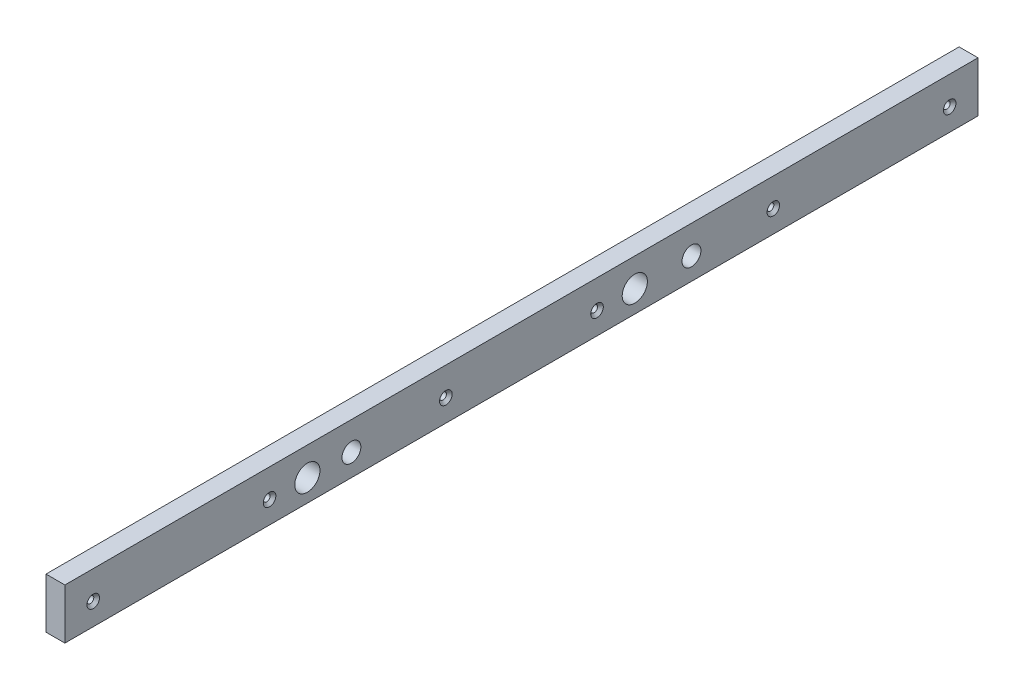
ISO-10303-21;
HEADER;
FILE_DESCRIPTION(('STEP AP214'),'2;1');
FILE_NAME('part.step','',(''),(''),'','','');
FILE_SCHEMA(('AUTOMOTIVE_DESIGN { 1 0 10303 214 1 1 1 1 }'));
ENDSEC;
DATA;
#1=APPLICATION_CONTEXT('core data for automotive mechanical design processes');
#2=APPLICATION_PROTOCOL_DEFINITION('international standard','automotive_design',2000,#1);
#3=PRODUCT_CONTEXT('',#1,'mechanical');
#4=PRODUCT('Part','Part','',(#3));
#5=PRODUCT_RELATED_PRODUCT_CATEGORY('part','',(#4));
#6=PRODUCT_DEFINITION_FORMATION('','',#4);
#7=PRODUCT_DEFINITION_CONTEXT('part definition',#1,'design');
#8=PRODUCT_DEFINITION('design','',#6,#7);
#9=PRODUCT_DEFINITION_SHAPE('','',#8);
#10=(LENGTH_UNIT() NAMED_UNIT(*) SI_UNIT(.MILLI.,.METRE.));
#11=(NAMED_UNIT(*) PLANE_ANGLE_UNIT() SI_UNIT($,.RADIAN.));
#12=(NAMED_UNIT(*) SI_UNIT($,.STERADIAN.) SOLID_ANGLE_UNIT());
#13=UNCERTAINTY_MEASURE_WITH_UNIT(LENGTH_MEASURE(1.E-05),#10,'distance_accuracy_value','');
#14=(GEOMETRIC_REPRESENTATION_CONTEXT(3) GLOBAL_UNCERTAINTY_ASSIGNED_CONTEXT((#13)) GLOBAL_UNIT_ASSIGNED_CONTEXT((#10,
#11,#12)) REPRESENTATION_CONTEXT('',''));
#15=CARTESIAN_POINT('',(0.,0.,0.));
#16=DIRECTION('',(0.,0.,1.));
#17=DIRECTION('',(1.,0.,0.));
#18=AXIS2_PLACEMENT_3D('',#15,#16,#17);
#19=CARTESIAN_POINT('',(4.7625,12.7,230.1875));
#20=DIRECTION('',(-1.,0.,0.));
#21=DIRECTION('',(0.,-1.,0.));
#22=AXIS2_PLACEMENT_3D('',#19,#20,#21);
#23=PLANE('',#22);
#24=CARTESIAN_POINT('',(4.7625,-1.5875,-38.1));
#25=DIRECTION('',(1.,0.,0.));
#26=DIRECTION('',(0.,0.,-1.));
#27=AXIS2_PLACEMENT_3D('',#24,#25,#26);
#28=CIRCLE('',#27,3.175);
#29=CARTESIAN_POINT('',(4.7625,-1.5875,-41.275));
#30=VERTEX_POINT('',#29);
#31=EDGE_CURVE('E522',#30,#30,#28,.T.);
#32=ORIENTED_EDGE('',*,*,#31,.F.);
#33=EDGE_LOOP('',(#32));
#34=FACE_BOUND('',#33,.T.);
#35=CARTESIAN_POINT('',(4.7625,-1.5875,215.9));
#36=DIRECTION('',(1.,0.,0.));
#37=DIRECTION('',(0.,0.,-1.));
#38=AXIS2_PLACEMENT_3D('',#35,#36,#37);
#39=CIRCLE('',#38,3.175);
#40=CARTESIAN_POINT('',(4.7625,-1.5875,212.725));
#41=VERTEX_POINT('',#40);
#42=EDGE_CURVE('E507',#41,#41,#39,.T.);
#43=ORIENTED_EDGE('',*,*,#42,.F.);
#44=EDGE_LOOP('',(#43));
#45=FACE_BOUND('',#44,.T.);
#46=CARTESIAN_POINT('',(4.7625,-1.5875,-127.));
#47=DIRECTION('',(1.,0.,0.));
#48=DIRECTION('',(0.,0.,-1.));
#49=AXIS2_PLACEMENT_3D('',#46,#47,#48);
#50=CIRCLE('',#49,3.175);
#51=CARTESIAN_POINT('',(4.7625,-1.5875,-130.175));
#52=VERTEX_POINT('',#51);
#53=EDGE_CURVE('E156',#52,#52,#50,.T.);
#54=ORIENTED_EDGE('',*,*,#53,.F.);
#55=EDGE_LOOP('',(#54));
#56=FACE_BOUND('',#55,.T.);
#57=CARTESIAN_POINT('',(4.7625,-1.5875,85.725));
#58=DIRECTION('',(-1.,0.,0.));
#59=DIRECTION('',(0.,0.,1.));
#60=AXIS2_PLACEMENT_3D('',#57,#58,#59);
#61=CIRCLE('',#60,4.7625);
#62=CARTESIAN_POINT('',(4.7625,-1.5875,90.4875));
#63=VERTEX_POINT('',#62);
#64=EDGE_CURVE('E170',#63,#63,#61,.T.);
#65=ORIENTED_EDGE('',*,*,#64,.T.);
#66=EDGE_LOOP('',(#65));
#67=FACE_BOUND('',#66,.T.);
#68=CARTESIAN_POINT('',(4.7625,-1.5875,-85.725));
#69=DIRECTION('',(-1.,0.,0.));
#70=DIRECTION('',(0.,0.,1.));
#71=AXIS2_PLACEMENT_3D('',#68,#69,#70);
#72=CIRCLE('',#71,4.7625);
#73=CARTESIAN_POINT('',(4.7625,-1.5875,-80.9625));
#74=VERTEX_POINT('',#73);
#75=EDGE_CURVE('E181',#74,#74,#72,.T.);
#76=ORIENTED_EDGE('',*,*,#75,.T.);
#77=EDGE_LOOP('',(#76));
#78=FACE_BOUND('',#77,.T.);
#79=CARTESIAN_POINT('',(4.7625,-1.5875,-57.15));
#80=DIRECTION('',(1.,0.,0.));
#81=DIRECTION('',(0.,1.,0.));
#82=AXIS2_PLACEMENT_3D('',#79,#80,#81);
#83=CIRCLE('',#82,6.35000000000003);
#84=CARTESIAN_POINT('',(4.7625,4.76250000000003,-57.15));
#85=VERTEX_POINT('',#84);
#86=EDGE_CURVE('E183',#85,#85,#83,.T.);
#87=ORIENTED_EDGE('',*,*,#86,.F.);
#88=EDGE_LOOP('',(#87));
#89=FACE_BOUND('',#88,.T.);
#90=CARTESIAN_POINT('',(4.7625,-1.5875,107.95));
#91=DIRECTION('',(1.,0.,0.));
#92=DIRECTION('',(0.,1.,0.));
#93=AXIS2_PLACEMENT_3D('',#90,#91,#92);
#94=CIRCLE('',#93,6.35);
#95=CARTESIAN_POINT('',(4.7625,4.7625,107.95));
#96=VERTEX_POINT('',#95);
#97=EDGE_CURVE('E124',#96,#96,#94,.T.);
#98=ORIENTED_EDGE('',*,*,#97,.F.);
#99=EDGE_LOOP('',(#98));
#100=FACE_BOUND('',#99,.T.);
#101=DIRECTION('',(0.,1.,0.));
#102=VECTOR('',#101,1.);
#103=CARTESIAN_POINT('',(4.7625,12.7,-230.1875));
#104=LINE('',#103,#102);
#105=CARTESIAN_POINT('',(4.7625,-12.7,-230.1875));
#106=VERTEX_POINT('',#105);
#107=CARTESIAN_POINT('',(4.7625,12.7,-230.1875));
#108=VERTEX_POINT('',#107);
#109=EDGE_CURVE('E73',#106,#108,#104,.T.);
#110=ORIENTED_EDGE('',*,*,#109,.T.);
#111=DIRECTION('',(0.,0.,-1.));
#112=VECTOR('',#111,1.);
#113=CARTESIAN_POINT('',(4.7625,12.7,230.1875));
#114=LINE('',#113,#112);
#115=CARTESIAN_POINT('',(4.7625,12.7,230.1875));
#116=VERTEX_POINT('',#115);
#117=EDGE_CURVE('E100',#116,#108,#114,.T.);
#118=ORIENTED_EDGE('',*,*,#117,.F.);
#119=DIRECTION('',(0.,1.,0.));
#120=VECTOR('',#119,1.);
#121=CARTESIAN_POINT('',(4.7625,12.7,230.1875));
#122=LINE('',#121,#120);
#123=CARTESIAN_POINT('',(4.7625,-12.7,230.1875));
#124=VERTEX_POINT('',#123);
#125=EDGE_CURVE('E93',#124,#116,#122,.T.);
#126=ORIENTED_EDGE('',*,*,#125,.F.);
#127=DIRECTION('',(0.,0.,-1.));
#128=VECTOR('',#127,1.);
#129=CARTESIAN_POINT('',(4.7625,-12.7,230.1875));
#130=LINE('',#129,#128);
#131=EDGE_CURVE('E48',#124,#106,#130,.T.);
#132=ORIENTED_EDGE('',*,*,#131,.T.);
#133=EDGE_LOOP('',(#110,#118,#126,#132));
#134=FACE_BOUND('',#133,.T.);
#135=CARTESIAN_POINT('',(4.7625,-1.5875,127.));
#136=DIRECTION('',(1.,0.,0.));
#137=DIRECTION('',(0.,0.,-1.));
#138=AXIS2_PLACEMENT_3D('',#135,#136,#137);
#139=CIRCLE('',#138,3.175);
#140=CARTESIAN_POINT('',(4.7625,-1.5875,123.825));
#141=VERTEX_POINT('',#140);
#142=EDGE_CURVE('E141',#141,#141,#139,.T.);
#143=ORIENTED_EDGE('',*,*,#142,.F.);
#144=EDGE_LOOP('',(#143));
#145=FACE_BOUND('',#144,.T.);
#146=CARTESIAN_POINT('',(4.7625,-1.5875,38.1));
#147=DIRECTION('',(1.,0.,0.));
#148=DIRECTION('',(0.,0.,-1.));
#149=AXIS2_PLACEMENT_3D('',#146,#147,#148);
#150=CIRCLE('',#149,3.175);
#151=CARTESIAN_POINT('',(4.7625,-1.5875,34.925));
#152=VERTEX_POINT('',#151);
#153=EDGE_CURVE('E516',#152,#152,#150,.T.);
#154=ORIENTED_EDGE('',*,*,#153,.F.);
#155=EDGE_LOOP('',(#154));
#156=FACE_BOUND('',#155,.T.);
#157=CARTESIAN_POINT('',(4.7625,-1.5875,-215.9));
#158=DIRECTION('',(1.,0.,0.));
#159=DIRECTION('',(0.,0.,-1.));
#160=AXIS2_PLACEMENT_3D('',#157,#158,#159);
#161=CIRCLE('',#160,3.175);
#162=CARTESIAN_POINT('',(4.7625,-1.5875,-219.075));
#163=VERTEX_POINT('',#162);
#164=EDGE_CURVE('E530',#163,#163,#161,.T.);
#165=ORIENTED_EDGE('',*,*,#164,.F.);
#166=EDGE_LOOP('',(#165));
#167=FACE_BOUND('',#166,.T.);
#168=ADVANCED_FACE('F39',(#34,#45,#56,#67,#78,#89,#100,#134,#145,#156,#167),#23,.F.);
#169=CARTESIAN_POINT('',(-4.7625,12.7,230.1875));
#170=DIRECTION('',(1.,0.,0.));
#171=DIRECTION('',(0.,1.,0.));
#172=AXIS2_PLACEMENT_3D('',#169,#170,#171);
#173=PLANE('',#172);
#174=CARTESIAN_POINT('',(-4.7625,-1.5875,-215.9));
#175=DIRECTION('',(1.,0.,0.));
#176=DIRECTION('',(0.,0.,-1.));
#177=AXIS2_PLACEMENT_3D('',#174,#175,#176);
#178=CIRCLE('',#177,2.286);
#179=CARTESIAN_POINT('',(-4.7625,-1.5875,-218.186));
#180=VERTEX_POINT('',#179);
#181=EDGE_CURVE('E527',#180,#180,#178,.T.);
#182=ORIENTED_EDGE('',*,*,#181,.T.);
#183=EDGE_LOOP('',(#182));
#184=FACE_BOUND('',#183,.T.);
#185=CARTESIAN_POINT('',(-4.7625,-1.5875,-38.1));
#186=DIRECTION('',(1.,0.,0.));
#187=DIRECTION('',(0.,0.,-1.));
#188=AXIS2_PLACEMENT_3D('',#185,#186,#187);
#189=CIRCLE('',#188,2.286);
#190=CARTESIAN_POINT('',(-4.7625,-1.5875,-40.386));
#191=VERTEX_POINT('',#190);
#192=EDGE_CURVE('E519',#191,#191,#189,.T.);
#193=ORIENTED_EDGE('',*,*,#192,.T.);
#194=EDGE_LOOP('',(#193));
#195=FACE_BOUND('',#194,.T.);
#196=CARTESIAN_POINT('',(-4.7625,-1.5875,38.1));
#197=DIRECTION('',(1.,0.,0.));
#198=DIRECTION('',(0.,0.,-1.));
#199=AXIS2_PLACEMENT_3D('',#196,#197,#198);
#200=CIRCLE('',#199,2.286);
#201=CARTESIAN_POINT('',(-4.7625,-1.5875,35.814));
#202=VERTEX_POINT('',#201);
#203=EDGE_CURVE('E512',#202,#202,#200,.T.);
#204=ORIENTED_EDGE('',*,*,#203,.T.);
#205=EDGE_LOOP('',(#204));
#206=FACE_BOUND('',#205,.T.);
#207=CARTESIAN_POINT('',(-4.7625,-1.5875,215.9));
#208=DIRECTION('',(1.,0.,0.));
#209=DIRECTION('',(0.,0.,-1.));
#210=AXIS2_PLACEMENT_3D('',#207,#208,#209);
#211=CIRCLE('',#210,2.286);
#212=CARTESIAN_POINT('',(-4.7625,-1.5875,213.614));
#213=VERTEX_POINT('',#212);
#214=EDGE_CURVE('E504',#213,#213,#211,.T.);
#215=ORIENTED_EDGE('',*,*,#214,.T.);
#216=EDGE_LOOP('',(#215));
#217=FACE_BOUND('',#216,.T.);
#218=CARTESIAN_POINT('',(-4.7625,-1.5875,127.));
#219=DIRECTION('',(1.,0.,0.));
#220=DIRECTION('',(0.,0.,-1.));
#221=AXIS2_PLACEMENT_3D('',#218,#219,#220);
#222=CIRCLE('',#221,2.286);
#223=CARTESIAN_POINT('',(-4.7625,-1.5875,124.714));
#224=VERTEX_POINT('',#223);
#225=EDGE_CURVE('E135',#224,#224,#222,.T.);
#226=ORIENTED_EDGE('',*,*,#225,.T.);
#227=EDGE_LOOP('',(#226));
#228=FACE_BOUND('',#227,.T.);
#229=CARTESIAN_POINT('',(-4.7625,-1.5875,-127.));
#230=DIRECTION('',(1.,0.,0.));
#231=DIRECTION('',(0.,0.,-1.));
#232=AXIS2_PLACEMENT_3D('',#229,#230,#231);
#233=CIRCLE('',#232,2.286);
#234=CARTESIAN_POINT('',(-4.7625,-1.5875,-129.286));
#235=VERTEX_POINT('',#234);
#236=EDGE_CURVE('E151',#235,#235,#233,.T.);
#237=ORIENTED_EDGE('',*,*,#236,.T.);
#238=EDGE_LOOP('',(#237));
#239=FACE_BOUND('',#238,.T.);
#240=CARTESIAN_POINT('',(-4.7625,-1.5875,85.725));
#241=DIRECTION('',(-1.,0.,0.));
#242=DIRECTION('',(0.,0.,1.));
#243=AXIS2_PLACEMENT_3D('',#240,#241,#242);
#244=CIRCLE('',#243,4.76249999999999);
#245=CARTESIAN_POINT('',(-4.7625,-1.5875,90.4875));
#246=VERTEX_POINT('',#245);
#247=EDGE_CURVE('E165',#246,#246,#244,.T.);
#248=ORIENTED_EDGE('',*,*,#247,.F.);
#249=EDGE_LOOP('',(#248));
#250=FACE_BOUND('',#249,.T.);
#251=CARTESIAN_POINT('',(-4.7625,-1.5875,-85.725));
#252=DIRECTION('',(-1.,0.,0.));
#253=DIRECTION('',(0.,0.,1.));
#254=AXIS2_PLACEMENT_3D('',#251,#252,#253);
#255=CIRCLE('',#254,4.76249999999999);
#256=CARTESIAN_POINT('',(-4.7625,-1.5875,-80.9625));
#257=VERTEX_POINT('',#256);
#258=EDGE_CURVE('E176',#257,#257,#255,.T.);
#259=ORIENTED_EDGE('',*,*,#258,.F.);
#260=EDGE_LOOP('',(#259));
#261=FACE_BOUND('',#260,.T.);
#262=CARTESIAN_POINT('',(-4.7625,-1.5875,-57.15));
#263=DIRECTION('',(1.,0.,0.));
#264=DIRECTION('',(0.,1.,0.));
#265=AXIS2_PLACEMENT_3D('',#262,#263,#264);
#266=CIRCLE('',#265,6.35000000000003);
#267=CARTESIAN_POINT('',(-4.7625,4.76250000000003,-57.15));
#268=VERTEX_POINT('',#267);
#269=EDGE_CURVE('E129',#268,#268,#266,.F.);
#270=ORIENTED_EDGE('',*,*,#269,.F.);
#271=EDGE_LOOP('',(#270));
#272=FACE_BOUND('',#271,.T.);
#273=CARTESIAN_POINT('',(-4.7625,-1.5875,107.95));
#274=DIRECTION('',(1.,0.,0.));
#275=DIRECTION('',(0.,1.,0.));
#276=AXIS2_PLACEMENT_3D('',#273,#274,#275);
#277=CIRCLE('',#276,6.35);
#278=CARTESIAN_POINT('',(-4.7625,4.76249999999999,107.95));
#279=VERTEX_POINT('',#278);
#280=EDGE_CURVE('E110',#279,#279,#277,.F.);
#281=ORIENTED_EDGE('',*,*,#280,.F.);
#282=EDGE_LOOP('',(#281));
#283=FACE_BOUND('',#282,.T.);
#284=DIRECTION('',(0.,-1.,0.));
#285=VECTOR('',#284,1.);
#286=CARTESIAN_POINT('',(-4.7625,12.7,-230.1875));
#287=LINE('',#286,#285);
#288=CARTESIAN_POINT('',(-4.7625,12.7,-230.1875));
#289=VERTEX_POINT('',#288);
#290=CARTESIAN_POINT('',(-4.7625,-12.7,-230.1875));
#291=VERTEX_POINT('',#290);
#292=EDGE_CURVE('E107',#289,#291,#287,.T.);
#293=ORIENTED_EDGE('',*,*,#292,.T.);
#294=DIRECTION('',(0.,0.,-1.));
#295=VECTOR('',#294,1.);
#296=CARTESIAN_POINT('',(-4.7625,-12.7,230.1875));
#297=LINE('',#296,#295);
#298=CARTESIAN_POINT('',(-4.7625,-12.7,230.1875));
#299=VERTEX_POINT('',#298);
#300=EDGE_CURVE('E12',#299,#291,#297,.T.);
#301=ORIENTED_EDGE('',*,*,#300,.F.);
#302=DIRECTION('',(0.,-1.,0.));
#303=VECTOR('',#302,1.);
#304=CARTESIAN_POINT('',(-4.7625,12.7,230.1875));
#305=LINE('',#304,#303);
#306=CARTESIAN_POINT('',(-4.7625,12.7,230.1875));
#307=VERTEX_POINT('',#306);
#308=EDGE_CURVE('E95',#307,#299,#305,.T.);
#309=ORIENTED_EDGE('',*,*,#308,.F.);
#310=DIRECTION('',(0.,0.,-1.));
#311=VECTOR('',#310,1.);
#312=CARTESIAN_POINT('',(-4.7625,12.7,230.1875));
#313=LINE('',#312,#311);
#314=EDGE_CURVE('E103',#307,#289,#313,.T.);
#315=ORIENTED_EDGE('',*,*,#314,.T.);
#316=EDGE_LOOP('',(#293,#301,#309,#315));
#317=FACE_BOUND('',#316,.T.);
#318=ADVANCED_FACE('F41',(#184,#195,#206,#217,#228,#239,#250,#261,#272,#283,#317),#173,.F.);
#319=CARTESIAN_POINT('',(-4.7625,-12.7,230.1875));
#320=DIRECTION('',(0.,1.,0.));
#321=DIRECTION('',(0.,0.,1.));
#322=AXIS2_PLACEMENT_3D('',#319,#320,#321);
#323=PLANE('',#322);
#324=DIRECTION('',(1.,0.,0.));
#325=VECTOR('',#324,1.);
#326=CARTESIAN_POINT('',(-4.7625,-12.7,-230.1875));
#327=LINE('',#326,#325);
#328=EDGE_CURVE('E99',#291,#106,#327,.T.);
#329=ORIENTED_EDGE('',*,*,#328,.T.);
#330=ORIENTED_EDGE('',*,*,#131,.F.);
#331=DIRECTION('',(1.,0.,0.));
#332=VECTOR('',#331,1.);
#333=CARTESIAN_POINT('',(-4.7625,-12.7,230.1875));
#334=LINE('',#333,#332);
#335=EDGE_CURVE('E90',#299,#124,#334,.T.);
#336=ORIENTED_EDGE('',*,*,#335,.F.);
#337=ORIENTED_EDGE('',*,*,#300,.T.);
#338=EDGE_LOOP('',(#329,#330,#336,#337));
#339=FACE_BOUND('',#338,.T.);
#340=ADVANCED_FACE('F98',(#339),#323,.F.);
#341=CARTESIAN_POINT('',(-4.7625,12.7,230.1875));
#342=DIRECTION('',(0.,-1.,0.));
#343=DIRECTION('',(0.,0.,-1.));
#344=AXIS2_PLACEMENT_3D('',#341,#342,#343);
#345=PLANE('',#344);
#346=DIRECTION('',(-1.,0.,0.));
#347=VECTOR('',#346,1.);
#348=CARTESIAN_POINT('',(-4.7625,12.7,-230.1875));
#349=LINE('',#348,#347);
#350=EDGE_CURVE('E83',#108,#289,#349,.T.);
#351=ORIENTED_EDGE('',*,*,#350,.T.);
#352=ORIENTED_EDGE('',*,*,#314,.F.);
#353=DIRECTION('',(-1.,0.,0.));
#354=VECTOR('',#353,1.);
#355=CARTESIAN_POINT('',(-4.7625,12.7,230.1875));
#356=LINE('',#355,#354);
#357=EDGE_CURVE('E56',#116,#307,#356,.T.);
#358=ORIENTED_EDGE('',*,*,#357,.F.);
#359=ORIENTED_EDGE('',*,*,#117,.T.);
#360=EDGE_LOOP('',(#351,#352,#358,#359));
#361=FACE_BOUND('',#360,.T.);
#362=ADVANCED_FACE('F115',(#361),#345,.F.);
#363=CARTESIAN_POINT('',(-4.7625,-12.7,230.1875));
#364=DIRECTION('',(0.,0.,1.));
#365=DIRECTION('',(1.,0.,0.));
#366=AXIS2_PLACEMENT_3D('',#363,#364,#365);
#367=PLANE('',#366);
#368=ORIENTED_EDGE('',*,*,#308,.T.);
#369=ORIENTED_EDGE('',*,*,#335,.T.);
#370=ORIENTED_EDGE('',*,*,#125,.T.);
#371=ORIENTED_EDGE('',*,*,#357,.T.);
#372=EDGE_LOOP('',(#368,#369,#370,#371));
#373=FACE_BOUND('',#372,.T.);
#374=ADVANCED_FACE('F91',(#373),#367,.T.);
#375=CARTESIAN_POINT('',(-4.7625,-12.7,-230.1875));
#376=DIRECTION('',(0.,0.,1.));
#377=DIRECTION('',(1.,0.,0.));
#378=AXIS2_PLACEMENT_3D('',#375,#376,#377);
#379=PLANE('',#378);
#380=ORIENTED_EDGE('',*,*,#292,.F.);
#381=ORIENTED_EDGE('',*,*,#350,.F.);
#382=ORIENTED_EDGE('',*,*,#109,.F.);
#383=ORIENTED_EDGE('',*,*,#328,.F.);
#384=EDGE_LOOP('',(#380,#381,#382,#383));
#385=FACE_BOUND('',#384,.T.);
#386=ADVANCED_FACE('F118',(#385),#379,.F.);
#387=CARTESIAN_POINT('',(-4.7635,-1.5875,107.95));
#388=DIRECTION('',(1.,0.,0.));
#389=DIRECTION('',(0.,1.,0.));
#390=AXIS2_PLACEMENT_3D('',#387,#388,#389);
#391=CYLINDRICAL_SURFACE('',#390,6.35);
#392=ORIENTED_EDGE('',*,*,#97,.T.);
#393=EDGE_LOOP('',(#392));
#394=FACE_BOUND('',#393,.T.);
#395=ORIENTED_EDGE('',*,*,#280,.T.);
#396=EDGE_LOOP('',(#395));
#397=FACE_BOUND('',#396,.T.);
#398=ADVANCED_FACE('F201',(#394,#397),#391,.F.);
#399=CARTESIAN_POINT('',(-4.7635,-1.5875,-57.15));
#400=DIRECTION('',(1.,0.,0.));
#401=DIRECTION('',(0.,1.,0.));
#402=AXIS2_PLACEMENT_3D('',#399,#400,#401);
#403=CYLINDRICAL_SURFACE('',#402,6.35000000000003);
#404=ORIENTED_EDGE('',*,*,#86,.T.);
#405=EDGE_LOOP('',(#404));
#406=FACE_BOUND('',#405,.T.);
#407=ORIENTED_EDGE('',*,*,#269,.T.);
#408=EDGE_LOOP('',(#407));
#409=FACE_BOUND('',#408,.T.);
#410=ADVANCED_FACE('F194',(#406,#409),#403,.F.);
#411=CARTESIAN_POINT('',(-4.7625,-1.5875,-85.725));
#412=DIRECTION('',(-1.,0.,0.));
#413=DIRECTION('',(0.,0.,1.));
#414=AXIS2_PLACEMENT_3D('',#411,#412,#413);
#415=CYLINDRICAL_SURFACE('',#414,4.76249999999999);
#416=ORIENTED_EDGE('',*,*,#75,.F.);
#417=EDGE_LOOP('',(#416));
#418=FACE_BOUND('',#417,.T.);
#419=ORIENTED_EDGE('',*,*,#258,.T.);
#420=EDGE_LOOP('',(#419));
#421=FACE_BOUND('',#420,.T.);
#422=ADVANCED_FACE('F209',(#418,#421),#415,.F.);
#423=CARTESIAN_POINT('',(-4.7625,-1.5875,85.725));
#424=DIRECTION('',(-1.,0.,0.));
#425=DIRECTION('',(0.,0.,1.));
#426=AXIS2_PLACEMENT_3D('',#423,#424,#425);
#427=CYLINDRICAL_SURFACE('',#426,4.76249999999999);
#428=ORIENTED_EDGE('',*,*,#64,.F.);
#429=EDGE_LOOP('',(#428));
#430=FACE_BOUND('',#429,.T.);
#431=ORIENTED_EDGE('',*,*,#247,.T.);
#432=EDGE_LOOP('',(#431));
#433=FACE_BOUND('',#432,.T.);
#434=ADVANCED_FACE('F252',(#430,#433),#427,.F.);
#435=CARTESIAN_POINT('',(-4.2037,-1.5875,-127.));
#436=DIRECTION('',(-1.,0.,0.));
#437=DIRECTION('',(0.,0.,1.));
#438=AXIS2_PLACEMENT_3D('',#435,#436,#437);
#439=CONICAL_SURFACE('',#438,1.7272,0.785398163397448);
#440=ORIENTED_EDGE('',*,*,#236,.F.);
#441=EDGE_LOOP('',(#440));
#442=FACE_BOUND('',#441,.T.);
#443=CARTESIAN_POINT('',(-4.2037,-1.5875,-127.));
#444=DIRECTION('',(1.,0.,0.));
#445=DIRECTION('',(0.,0.,-1.));
#446=AXIS2_PLACEMENT_3D('',#443,#444,#445);
#447=CIRCLE('',#446,1.7272);
#448=CARTESIAN_POINT('',(-4.2037,-1.5875,-128.7272));
#449=VERTEX_POINT('',#448);
#450=EDGE_CURVE('E162',#449,#449,#447,.T.);
#451=ORIENTED_EDGE('',*,*,#450,.T.);
#452=EDGE_LOOP('',(#451));
#453=FACE_BOUND('',#452,.T.);
#454=ADVANCED_FACE('F262',(#442,#453),#439,.F.);
#455=CARTESIAN_POINT('',(4.7625,-1.5875,-127.));
#456=DIRECTION('',(1.,0.,0.));
#457=DIRECTION('',(0.,0.,-1.));
#458=AXIS2_PLACEMENT_3D('',#455,#456,#457);
#459=CYLINDRICAL_SURFACE('',#458,1.7272);
#460=ORIENTED_EDGE('',*,*,#450,.F.);
#461=EDGE_LOOP('',(#460));
#462=FACE_BOUND('',#461,.T.);
#463=CARTESIAN_POINT('',(3.3147,-1.5875,-127.));
#464=DIRECTION('',(1.,0.,0.));
#465=DIRECTION('',(0.,0.,-1.));
#466=AXIS2_PLACEMENT_3D('',#463,#464,#465);
#467=CIRCLE('',#466,1.7272);
#468=CARTESIAN_POINT('',(3.3147,-1.5875,-128.7272));
#469=VERTEX_POINT('',#468);
#470=EDGE_CURVE('E159',#469,#469,#467,.T.);
#471=ORIENTED_EDGE('',*,*,#470,.T.);
#472=EDGE_LOOP('',(#471));
#473=FACE_BOUND('',#472,.T.);
#474=ADVANCED_FACE('F449',(#462,#473),#459,.F.);
#475=CARTESIAN_POINT('',(4.7625,-1.5875,-127.));
#476=DIRECTION('',(1.,0.,0.));
#477=DIRECTION('',(0.,0.,-1.));
#478=AXIS2_PLACEMENT_3D('',#475,#476,#477);
#479=CONICAL_SURFACE('',#478,3.175,0.785398163397448);
#480=ORIENTED_EDGE('',*,*,#470,.F.);
#481=EDGE_LOOP('',(#480));
#482=FACE_BOUND('',#481,.T.);
#483=ORIENTED_EDGE('',*,*,#53,.T.);
#484=EDGE_LOOP('',(#483));
#485=FACE_BOUND('',#484,.T.);
#486=ADVANCED_FACE('F440',(#482,#485),#479,.F.);
#487=CARTESIAN_POINT('',(-4.2037,-1.5875,127.));
#488=DIRECTION('',(-1.,0.,0.));
#489=DIRECTION('',(0.,0.,1.));
#490=AXIS2_PLACEMENT_3D('',#487,#488,#489);
#491=CONICAL_SURFACE('',#490,1.7272,0.785398163397448);
#492=ORIENTED_EDGE('',*,*,#225,.F.);
#493=EDGE_LOOP('',(#492));
#494=FACE_BOUND('',#493,.T.);
#495=CARTESIAN_POINT('',(-4.2037,-1.5875,127.));
#496=DIRECTION('',(1.,0.,0.));
#497=DIRECTION('',(0.,0.,-1.));
#498=AXIS2_PLACEMENT_3D('',#495,#496,#497);
#499=CIRCLE('',#498,1.7272);
#500=CARTESIAN_POINT('',(-4.2037,-1.5875,125.2728));
#501=VERTEX_POINT('',#500);
#502=EDGE_CURVE('E149',#501,#501,#499,.T.);
#503=ORIENTED_EDGE('',*,*,#502,.T.);
#504=EDGE_LOOP('',(#503));
#505=FACE_BOUND('',#504,.T.);
#506=ADVANCED_FACE('F431',(#494,#505),#491,.F.);
#507=CARTESIAN_POINT('',(4.7625,-1.5875,127.));
#508=DIRECTION('',(1.,0.,0.));
#509=DIRECTION('',(0.,0.,-1.));
#510=AXIS2_PLACEMENT_3D('',#507,#508,#509);
#511=CYLINDRICAL_SURFACE('',#510,1.7272);
#512=ORIENTED_EDGE('',*,*,#502,.F.);
#513=EDGE_LOOP('',(#512));
#514=FACE_BOUND('',#513,.T.);
#515=CARTESIAN_POINT('',(3.3147,-1.5875,127.));
#516=DIRECTION('',(1.,0.,0.));
#517=DIRECTION('',(0.,0.,-1.));
#518=AXIS2_PLACEMENT_3D('',#515,#516,#517);
#519=CIRCLE('',#518,1.7272);
#520=CARTESIAN_POINT('',(3.3147,-1.5875,125.2728));
#521=VERTEX_POINT('',#520);
#522=EDGE_CURVE('E146',#521,#521,#519,.T.);
#523=ORIENTED_EDGE('',*,*,#522,.T.);
#524=EDGE_LOOP('',(#523));
#525=FACE_BOUND('',#524,.T.);
#526=ADVANCED_FACE('F422',(#514,#525),#511,.F.);
#527=CARTESIAN_POINT('',(4.7625,-1.5875,127.));
#528=DIRECTION('',(1.,0.,0.));
#529=DIRECTION('',(0.,0.,-1.));
#530=AXIS2_PLACEMENT_3D('',#527,#528,#529);
#531=CONICAL_SURFACE('',#530,3.175,0.785398163397448);
#532=ORIENTED_EDGE('',*,*,#522,.F.);
#533=EDGE_LOOP('',(#532));
#534=FACE_BOUND('',#533,.T.);
#535=ORIENTED_EDGE('',*,*,#142,.T.);
#536=EDGE_LOOP('',(#535));
#537=FACE_BOUND('',#536,.T.);
#538=ADVANCED_FACE('F276',(#534,#537),#531,.F.);
#539=CARTESIAN_POINT('',(-4.2037,-1.5875,215.9));
#540=DIRECTION('',(-1.,0.,0.));
#541=DIRECTION('',(0.,0.,1.));
#542=AXIS2_PLACEMENT_3D('',#539,#540,#541);
#543=CONICAL_SURFACE('',#542,1.7272,0.785398163397448);
#544=ORIENTED_EDGE('',*,*,#214,.F.);
#545=EDGE_LOOP('',(#544));
#546=FACE_BOUND('',#545,.T.);
#547=CARTESIAN_POINT('',(-4.2037,-1.5875,215.9));
#548=DIRECTION('',(1.,0.,0.));
#549=DIRECTION('',(0.,0.,-1.));
#550=AXIS2_PLACEMENT_3D('',#547,#548,#549);
#551=CIRCLE('',#550,1.7272);
#552=CARTESIAN_POINT('',(-4.2037,-1.5875,214.1728));
#553=VERTEX_POINT('',#552);
#554=EDGE_CURVE('E142',#553,#553,#551,.T.);
#555=ORIENTED_EDGE('',*,*,#554,.T.);
#556=EDGE_LOOP('',(#555));
#557=FACE_BOUND('',#556,.T.);
#558=ADVANCED_FACE('F270',(#546,#557),#543,.F.);
#559=CARTESIAN_POINT('',(4.7625,-1.5875,215.9));
#560=DIRECTION('',(1.,0.,0.));
#561=DIRECTION('',(0.,0.,-1.));
#562=AXIS2_PLACEMENT_3D('',#559,#560,#561);
#563=CYLINDRICAL_SURFACE('',#562,1.7272);
#564=ORIENTED_EDGE('',*,*,#554,.F.);
#565=EDGE_LOOP('',(#564));
#566=FACE_BOUND('',#565,.T.);
#567=CARTESIAN_POINT('',(3.3147,-1.5875,215.9));
#568=DIRECTION('',(1.,0.,0.));
#569=DIRECTION('',(0.,0.,-1.));
#570=AXIS2_PLACEMENT_3D('',#567,#568,#569);
#571=CIRCLE('',#570,1.7272);
#572=CARTESIAN_POINT('',(3.3147,-1.5875,214.1728));
#573=VERTEX_POINT('',#572);
#574=EDGE_CURVE('E561',#573,#573,#571,.T.);
#575=ORIENTED_EDGE('',*,*,#574,.T.);
#576=EDGE_LOOP('',(#575));
#577=FACE_BOUND('',#576,.T.);
#578=ADVANCED_FACE('F275',(#566,#577),#563,.F.);
#579=CARTESIAN_POINT('',(4.7625,-1.5875,215.9));
#580=DIRECTION('',(1.,0.,0.));
#581=DIRECTION('',(0.,0.,-1.));
#582=AXIS2_PLACEMENT_3D('',#579,#580,#581);
#583=CONICAL_SURFACE('',#582,3.175,0.785398163397448);
#584=ORIENTED_EDGE('',*,*,#574,.F.);
#585=EDGE_LOOP('',(#584));
#586=FACE_BOUND('',#585,.T.);
#587=ORIENTED_EDGE('',*,*,#42,.T.);
#588=EDGE_LOOP('',(#587));
#589=FACE_BOUND('',#588,.T.);
#590=ADVANCED_FACE('F288',(#586,#589),#583,.F.);
#591=CARTESIAN_POINT('',(-4.2037,-1.5875,38.1));
#592=DIRECTION('',(-1.,0.,0.));
#593=DIRECTION('',(0.,0.,1.));
#594=AXIS2_PLACEMENT_3D('',#591,#592,#593);
#595=CONICAL_SURFACE('',#594,1.7272,0.785398163397448);
#596=ORIENTED_EDGE('',*,*,#203,.F.);
#597=EDGE_LOOP('',(#596));
#598=FACE_BOUND('',#597,.T.);
#599=CARTESIAN_POINT('',(-4.2037,-1.5875,38.1));
#600=DIRECTION('',(1.,0.,0.));
#601=DIRECTION('',(0.,0.,-1.));
#602=AXIS2_PLACEMENT_3D('',#599,#600,#601);
#603=CIRCLE('',#602,1.7272);
#604=CARTESIAN_POINT('',(-4.2037,-1.5875,36.3728));
#605=VERTEX_POINT('',#604);
#606=EDGE_CURVE('E508',#605,#605,#603,.T.);
#607=ORIENTED_EDGE('',*,*,#606,.T.);
#608=EDGE_LOOP('',(#607));
#609=FACE_BOUND('',#608,.T.);
#610=ADVANCED_FACE('F298',(#598,#609),#595,.F.);
#611=CARTESIAN_POINT('',(4.7625,-1.5875,38.1));
#612=DIRECTION('',(1.,0.,0.));
#613=DIRECTION('',(0.,0.,-1.));
#614=AXIS2_PLACEMENT_3D('',#611,#612,#613);
#615=CYLINDRICAL_SURFACE('',#614,1.7272);
#616=ORIENTED_EDGE('',*,*,#606,.F.);
#617=EDGE_LOOP('',(#616));
#618=FACE_BOUND('',#617,.T.);
#619=CARTESIAN_POINT('',(3.3147,-1.5875,38.1));
#620=DIRECTION('',(1.,0.,0.));
#621=DIRECTION('',(0.,0.,-1.));
#622=AXIS2_PLACEMENT_3D('',#619,#620,#621);
#623=CIRCLE('',#622,1.7272);
#624=CARTESIAN_POINT('',(3.3147,-1.5875,36.3728));
#625=VERTEX_POINT('',#624);
#626=EDGE_CURVE('E554',#625,#625,#623,.T.);
#627=ORIENTED_EDGE('',*,*,#626,.T.);
#628=EDGE_LOOP('',(#627));
#629=FACE_BOUND('',#628,.T.);
#630=ADVANCED_FACE('F308',(#618,#629),#615,.F.);
#631=CARTESIAN_POINT('',(4.7625,-1.5875,38.1));
#632=DIRECTION('',(1.,0.,0.));
#633=DIRECTION('',(0.,0.,-1.));
#634=AXIS2_PLACEMENT_3D('',#631,#632,#633);
#635=CONICAL_SURFACE('',#634,3.175,0.785398163397448);
#636=ORIENTED_EDGE('',*,*,#626,.F.);
#637=EDGE_LOOP('',(#636));
#638=FACE_BOUND('',#637,.T.);
#639=ORIENTED_EDGE('',*,*,#153,.T.);
#640=EDGE_LOOP('',(#639));
#641=FACE_BOUND('',#640,.T.);
#642=ADVANCED_FACE('F318',(#638,#641),#635,.F.);
#643=CARTESIAN_POINT('',(-4.2037,-1.5875,-38.1));
#644=DIRECTION('',(-1.,0.,0.));
#645=DIRECTION('',(0.,0.,1.));
#646=AXIS2_PLACEMENT_3D('',#643,#644,#645);
#647=CONICAL_SURFACE('',#646,1.7272,0.785398163397448);
#648=ORIENTED_EDGE('',*,*,#192,.F.);
#649=EDGE_LOOP('',(#648));
#650=FACE_BOUND('',#649,.T.);
#651=CARTESIAN_POINT('',(-4.2037,-1.5875,-38.1));
#652=DIRECTION('',(1.,0.,0.));
#653=DIRECTION('',(0.,0.,-1.));
#654=AXIS2_PLACEMENT_3D('',#651,#652,#653);
#655=CIRCLE('',#654,1.7272);
#656=CARTESIAN_POINT('',(-4.2037,-1.5875,-39.8272));
#657=VERTEX_POINT('',#656);
#658=EDGE_CURVE('E517',#657,#657,#655,.T.);
#659=ORIENTED_EDGE('',*,*,#658,.T.);
#660=EDGE_LOOP('',(#659));
#661=FACE_BOUND('',#660,.T.);
#662=ADVANCED_FACE('F328',(#650,#661),#647,.F.);
#663=CARTESIAN_POINT('',(4.7625,-1.5875,-38.1));
#664=DIRECTION('',(1.,0.,0.));
#665=DIRECTION('',(0.,0.,-1.));
#666=AXIS2_PLACEMENT_3D('',#663,#664,#665);
#667=CYLINDRICAL_SURFACE('',#666,1.7272);
#668=ORIENTED_EDGE('',*,*,#658,.F.);
#669=EDGE_LOOP('',(#668));
#670=FACE_BOUND('',#669,.T.);
#671=CARTESIAN_POINT('',(3.3147,-1.5875,-38.1));
#672=DIRECTION('',(1.,0.,0.));
#673=DIRECTION('',(0.,0.,-1.));
#674=AXIS2_PLACEMENT_3D('',#671,#672,#673);
#675=CIRCLE('',#674,1.7272);
#676=CARTESIAN_POINT('',(3.3147,-1.5875,-39.8272));
#677=VERTEX_POINT('',#676);
#678=EDGE_CURVE('E546',#677,#677,#675,.T.);
#679=ORIENTED_EDGE('',*,*,#678,.T.);
#680=EDGE_LOOP('',(#679));
#681=FACE_BOUND('',#680,.T.);
#682=ADVANCED_FACE('F338',(#670,#681),#667,.F.);
#683=CARTESIAN_POINT('',(4.7625,-1.5875,-38.1));
#684=DIRECTION('',(1.,0.,0.));
#685=DIRECTION('',(0.,0.,-1.));
#686=AXIS2_PLACEMENT_3D('',#683,#684,#685);
#687=CONICAL_SURFACE('',#686,3.175,0.785398163397448);
#688=ORIENTED_EDGE('',*,*,#678,.F.);
#689=EDGE_LOOP('',(#688));
#690=FACE_BOUND('',#689,.T.);
#691=ORIENTED_EDGE('',*,*,#31,.T.);
#692=EDGE_LOOP('',(#691));
#693=FACE_BOUND('',#692,.T.);
#694=ADVANCED_FACE('F348',(#690,#693),#687,.F.);
#695=CARTESIAN_POINT('',(-4.2037,-1.5875,-215.9));
#696=DIRECTION('',(-1.,0.,0.));
#697=DIRECTION('',(0.,0.,1.));
#698=AXIS2_PLACEMENT_3D('',#695,#696,#697);
#699=CONICAL_SURFACE('',#698,1.7272,0.785398163397448);
#700=ORIENTED_EDGE('',*,*,#181,.F.);
#701=EDGE_LOOP('',(#700));
#702=FACE_BOUND('',#701,.T.);
#703=CARTESIAN_POINT('',(-4.2037,-1.5875,-215.9));
#704=DIRECTION('',(1.,0.,0.));
#705=DIRECTION('',(0.,0.,-1.));
#706=AXIS2_PLACEMENT_3D('',#703,#704,#705);
#707=CIRCLE('',#706,1.7272);
#708=CARTESIAN_POINT('',(-4.2037,-1.5875,-217.6272));
#709=VERTEX_POINT('',#708);
#710=EDGE_CURVE('E523',#709,#709,#707,.T.);
#711=ORIENTED_EDGE('',*,*,#710,.T.);
#712=EDGE_LOOP('',(#711));
#713=FACE_BOUND('',#712,.T.);
#714=ADVANCED_FACE('F358',(#702,#713),#699,.F.);
#715=CARTESIAN_POINT('',(4.7625,-1.5875,-215.9));
#716=DIRECTION('',(1.,0.,0.));
#717=DIRECTION('',(0.,0.,-1.));
#718=AXIS2_PLACEMENT_3D('',#715,#716,#717);
#719=CYLINDRICAL_SURFACE('',#718,1.7272);
#720=ORIENTED_EDGE('',*,*,#710,.F.);
#721=EDGE_LOOP('',(#720));
#722=FACE_BOUND('',#721,.T.);
#723=CARTESIAN_POINT('',(3.3147,-1.5875,-215.9));
#724=DIRECTION('',(1.,0.,0.));
#725=DIRECTION('',(0.,0.,-1.));
#726=AXIS2_PLACEMENT_3D('',#723,#724,#725);
#727=CIRCLE('',#726,1.7272);
#728=CARTESIAN_POINT('',(3.3147,-1.5875,-217.6272));
#729=VERTEX_POINT('',#728);
#730=EDGE_CURVE('E535',#729,#729,#727,.T.);
#731=ORIENTED_EDGE('',*,*,#730,.T.);
#732=EDGE_LOOP('',(#731));
#733=FACE_BOUND('',#732,.T.);
#734=ADVANCED_FACE('F368',(#722,#733),#719,.F.);
#735=CARTESIAN_POINT('',(4.7625,-1.5875,-215.9));
#736=DIRECTION('',(1.,0.,0.));
#737=DIRECTION('',(0.,0.,-1.));
#738=AXIS2_PLACEMENT_3D('',#735,#736,#737);
#739=CONICAL_SURFACE('',#738,3.175,0.785398163397448);
#740=ORIENTED_EDGE('',*,*,#730,.F.);
#741=EDGE_LOOP('',(#740));
#742=FACE_BOUND('',#741,.T.);
#743=ORIENTED_EDGE('',*,*,#164,.T.);
#744=EDGE_LOOP('',(#743));
#745=FACE_BOUND('',#744,.T.);
#746=ADVANCED_FACE('F378',(#742,#745),#739,.F.);
#747=CLOSED_SHELL('',(#168,#318,#340,#362,#374,#386,#398,#410,#422,#434,#454,#474,#486,#506,
#526,#538,#558,#578,#590,#610,#630,#642,#662,#682,#694,#714,#734,#746));
#748=MANIFOLD_SOLID_BREP('B2',#747);
#749=ADVANCED_BREP_SHAPE_REPRESENTATION('',(#18,#748),#14);
#750=SHAPE_DEFINITION_REPRESENTATION(#9,#749);
ENDSEC;
END-ISO-10303-21;
